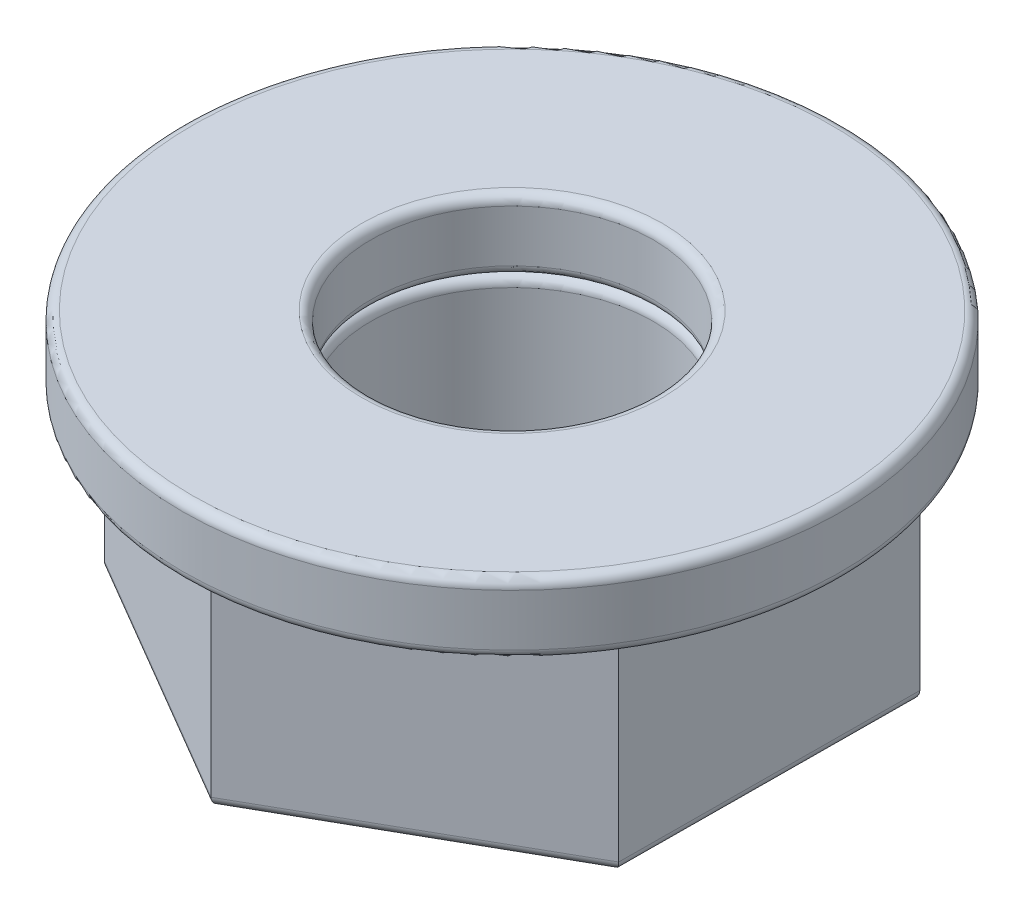
ISO-10303-21;
HEADER;
FILE_DESCRIPTION(('STEP AP214'),'2;1');
FILE_NAME('part.step','',(''),(''),'','','');
FILE_SCHEMA(('AUTOMOTIVE_DESIGN { 1 0 10303 214 1 1 1 1 }'));
ENDSEC;
DATA;
#1=APPLICATION_CONTEXT('core data for automotive mechanical design processes');
#2=APPLICATION_PROTOCOL_DEFINITION('international standard','automotive_design',2000,#1);
#3=PRODUCT_CONTEXT('',#1,'mechanical');
#4=PRODUCT('Part','Part','',(#3));
#5=PRODUCT_RELATED_PRODUCT_CATEGORY('part','',(#4));
#6=PRODUCT_DEFINITION_FORMATION('','',#4);
#7=PRODUCT_DEFINITION_CONTEXT('part definition',#1,'design');
#8=PRODUCT_DEFINITION('design','',#6,#7);
#9=PRODUCT_DEFINITION_SHAPE('','',#8);
#10=(LENGTH_UNIT() NAMED_UNIT(*) SI_UNIT(.MILLI.,.METRE.));
#11=(NAMED_UNIT(*) PLANE_ANGLE_UNIT() SI_UNIT($,.RADIAN.));
#12=(NAMED_UNIT(*) SI_UNIT($,.STERADIAN.) SOLID_ANGLE_UNIT());
#13=UNCERTAINTY_MEASURE_WITH_UNIT(LENGTH_MEASURE(1.E-05),#10,'distance_accuracy_value','');
#14=(GEOMETRIC_REPRESENTATION_CONTEXT(3) GLOBAL_UNCERTAINTY_ASSIGNED_CONTEXT((#13)) GLOBAL_UNIT_ASSIGNED_CONTEXT((#10,
#11,#12)) REPRESENTATION_CONTEXT('',''));
#15=CARTESIAN_POINT('',(0.,0.,0.));
#16=DIRECTION('',(0.,0.,1.));
#17=DIRECTION('',(1.,0.,0.));
#18=AXIS2_PLACEMENT_3D('',#15,#16,#17);
#19=CARTESIAN_POINT('',(0.,0.,0.));
#20=DIRECTION('',(0.,1.,0.));
#21=DIRECTION('',(0.,0.,1.));
#22=AXIS2_PLACEMENT_3D('',#19,#20,#21);
#23=PLANE('',#22);
#24=CARTESIAN_POINT('',(0.,0.,0.));
#25=DIRECTION('',(0.,1.,0.));
#26=DIRECTION('',(0.,0.,1.));
#27=AXIS2_PLACEMENT_3D('',#24,#25,#26);
#28=CIRCLE('',#27,1.6);
#29=CARTESIAN_POINT('',(0.,0.,1.6));
#30=VERTEX_POINT('',#29);
#31=EDGE_CURVE('E318',#30,#30,#28,.T.);
#32=ORIENTED_EDGE('',*,*,#31,.T.);
#33=EDGE_LOOP('',(#32));
#34=FACE_BOUND('',#33,.T.);
#35=DIRECTION('',(-0.862562362658581,0.,-0.505950758992263));
#36=VECTOR('',#35,1.);
#37=CARTESIAN_POINT('',(1.3407695113295,0.,-2.28579026104524));
#38=LINE('',#37,#36);
#39=CARTESIAN_POINT('',(0.0210678888040021,0.,-3.05988389933257));
#40=VERTEX_POINT('',#39);
#41=CARTESIAN_POINT('',(2.66047113385499,0.,-1.51169662275791));
#42=VERTEX_POINT('',#41);
#43=EDGE_CURVE('E379',#40,#42,#38,.F.);
#44=ORIENTED_EDGE('',*,*,#43,.T.);
#45=DIRECTION('',(0.00688502902202738,0.,-0.999976297906788));
#46=VECTOR('',#45,1.);
#47=CARTESIAN_POINT('',(2.64993718945299,0.,0.0182453269083725));
#48=LINE('',#47,#46);
#49=CARTESIAN_POINT('',(2.63940324505099,0.,1.54818727657465));
#50=VERTEX_POINT('',#49);
#51=EDGE_CURVE('E323',#42,#50,#48,.F.);
#52=ORIENTED_EDGE('',*,*,#51,.T.);
#53=DIRECTION('',(0.869447391680608,0.,-0.494025538914526));
#54=VECTOR('',#53,1.);
#55=CARTESIAN_POINT('',(1.30916767812349,0.,2.30403558795361));
#56=LINE('',#55,#54);
#57=CARTESIAN_POINT('',(-0.0210678888040024,0.,3.05988389933257));
#58=VERTEX_POINT('',#57);
#59=EDGE_CURVE('E366',#50,#58,#56,.F.);
#60=ORIENTED_EDGE('',*,*,#59,.T.);
#61=DIRECTION('',(0.862562362658581,0.,0.505950758992263));
#62=VECTOR('',#61,1.);
#63=CARTESIAN_POINT('',(-1.3407695113295,0.,2.28579026104524));
#64=LINE('',#63,#62);
#65=CARTESIAN_POINT('',(-2.66047113385499,0.,1.51169662275791));
#66=VERTEX_POINT('',#65);
#67=EDGE_CURVE('E373',#58,#66,#64,.F.);
#68=ORIENTED_EDGE('',*,*,#67,.T.);
#69=DIRECTION('',(-0.00688502902202696,0.,0.999976297906788));
#70=VECTOR('',#69,1.);
#71=CARTESIAN_POINT('',(-2.64993718945299,0.,-0.0182453269083715));
#72=LINE('',#71,#70);
#73=CARTESIAN_POINT('',(-2.63940324505099,0.,-1.54818727657465));
#74=VERTEX_POINT('',#73);
#75=EDGE_CURVE('E375',#66,#74,#72,.F.);
#76=ORIENTED_EDGE('',*,*,#75,.T.);
#77=DIRECTION('',(-0.869447391680608,0.,0.494025538914526));
#78=VECTOR('',#77,1.);
#79=CARTESIAN_POINT('',(-1.30916767812349,0.,-2.30403558795361));
#80=LINE('',#79,#78);
#81=EDGE_CURVE('E377',#74,#40,#80,.F.);
#82=ORIENTED_EDGE('',*,*,#81,.T.);
#83=EDGE_LOOP('',(#44,#52,#60,#68,#76,#82));
#84=FACE_BOUND('',#83,.T.);
#85=ADVANCED_FACE('F33',(#34,#84),#23,.F.);
#86=CARTESIAN_POINT('',(-0.0218629034758517,2.25,3.17535121628851));
#87=DIRECTION('',(-0.494025538914526,0.,-0.869447391680608));
#88=DIRECTION('',(-0.869447391680608,0.,0.494025538914526));
#89=AXIS2_PLACEMENT_3D('',#86,#87,#88);
#90=PLANE('',#89);
#91=DIRECTION('',(0.,-1.,0.));
#92=VECTOR('',#91,1.);
#93=CARTESIAN_POINT('',(-0.0218629034758517,2.25,3.17535121628851));
#94=LINE('',#93,#92);
#95=CARTESIAN_POINT('',(-0.0218629034758517,2.15,3.17535121628851));
#96=VERTEX_POINT('',#95);
#97=CARTESIAN_POINT('',(-0.0218629034758517,0.0999999999999998,3.17535121628851));
#98=VERTEX_POINT('',#97);
#99=EDGE_CURVE('E174',#96,#98,#94,.T.);
#100=ORIENTED_EDGE('',*,*,#99,.T.);
#101=DIRECTION('',(0.869447391680608,0.,-0.494025538914526));
#102=VECTOR('',#101,1.);
#103=CARTESIAN_POINT('',(-0.0218629034758517,0.0999999999999998,3.17535121628851));
#104=LINE('',#103,#102);
#105=CARTESIAN_POINT('',(2.73900336750574,0.0999999999999998,1.60660943795483));
#106=VERTEX_POINT('',#105);
#107=EDGE_CURVE('E136',#98,#106,#104,.T.);
#108=ORIENTED_EDGE('',*,*,#107,.T.);
#109=DIRECTION('',(0.,-1.,0.));
#110=VECTOR('',#109,1.);
#111=CARTESIAN_POINT('',(2.73900336750574,2.25,1.60660943795483));
#112=LINE('',#111,#110);
#113=CARTESIAN_POINT('',(2.73900336750574,2.15,1.60660943795483));
#114=VERTEX_POINT('',#113);
#115=EDGE_CURVE('E364',#114,#106,#112,.T.);
#116=ORIENTED_EDGE('',*,*,#115,.F.);
#117=DIRECTION('',(0.869447391680608,0.,-0.494025538914526));
#118=VECTOR('',#117,1.);
#119=CARTESIAN_POINT('',(-0.0218629034758517,2.15,3.17535121628851));
#120=LINE('',#119,#118);
#121=EDGE_CURVE('E346',#114,#96,#120,.F.);
#122=ORIENTED_EDGE('',*,*,#121,.T.);
#123=EDGE_LOOP('',(#100,#108,#116,#122));
#124=FACE_BOUND('',#123,.T.);
#125=ADVANCED_FACE('F217',(#124),#90,.F.);
#126=CARTESIAN_POINT('',(2.73900336750574,2.25,1.60660943795483));
#127=DIRECTION('',(-0.999976297906788,0.,-0.00688502902202737));
#128=DIRECTION('',(-0.00688502902202738,0.,0.999976297906788));
#129=AXIS2_PLACEMENT_3D('',#126,#127,#128);
#130=PLANE('',#129);
#131=ORIENTED_EDGE('',*,*,#115,.T.);
#132=DIRECTION('',(0.00688502902202738,0.,-0.999976297906788));
#133=VECTOR('',#132,1.);
#134=CARTESIAN_POINT('',(2.73900336750574,0.0999999999999998,1.60660943795483));
#135=LINE('',#134,#133);
#136=CARTESIAN_POINT('',(2.76086627098159,0.0999999999999998,-1.56874177833368));
#137=VERTEX_POINT('',#136);
#138=EDGE_CURVE('E328',#106,#137,#135,.T.);
#139=ORIENTED_EDGE('',*,*,#138,.T.);
#140=DIRECTION('',(0.,-1.,0.));
#141=VECTOR('',#140,1.);
#142=CARTESIAN_POINT('',(2.76086627098159,2.25,-1.56874177833368));
#143=LINE('',#142,#141);
#144=CARTESIAN_POINT('',(2.76086627098159,2.15,-1.56874177833368));
#145=VERTEX_POINT('',#144);
#146=EDGE_CURVE('E358',#145,#137,#143,.T.);
#147=ORIENTED_EDGE('',*,*,#146,.F.);
#148=DIRECTION('',(0.00688502902202738,0.,-0.999976297906788));
#149=VECTOR('',#148,1.);
#150=CARTESIAN_POINT('',(2.73900336750574,2.15,1.60660943795483));
#151=LINE('',#150,#149);
#152=EDGE_CURVE('E321',#145,#114,#151,.F.);
#153=ORIENTED_EDGE('',*,*,#152,.T.);
#154=EDGE_LOOP('',(#131,#139,#147,#153));
#155=FACE_BOUND('',#154,.T.);
#156=ADVANCED_FACE('F223',(#155),#130,.F.);
#157=CARTESIAN_POINT('',(2.76086627098159,2.25,-1.56874177833368));
#158=DIRECTION('',(-0.505950758992263,0.,0.862562362658581));
#159=DIRECTION('',(0.862562362658581,0.,0.505950758992263));
#160=AXIS2_PLACEMENT_3D('',#157,#158,#159);
#161=PLANE('',#160);
#162=ORIENTED_EDGE('',*,*,#146,.T.);
#163=DIRECTION('',(-0.862562362658581,0.,-0.505950758992263));
#164=VECTOR('',#163,1.);
#165=CARTESIAN_POINT('',(2.76086627098159,0.0999999999999998,-1.56874177833368));
#166=LINE('',#165,#164);
#167=CARTESIAN_POINT('',(0.0218629034758513,0.0999999999999998,-3.17535121628851));
#168=VERTEX_POINT('',#167);
#169=EDGE_CURVE('E333',#137,#168,#166,.T.);
#170=ORIENTED_EDGE('',*,*,#169,.T.);
#171=DIRECTION('',(0.,-1.,0.));
#172=VECTOR('',#171,1.);
#173=CARTESIAN_POINT('',(0.0218629034758513,2.25,-3.17535121628851));
#174=LINE('',#173,#172);
#175=CARTESIAN_POINT('',(0.0218629034758513,2.15,-3.17535121628851));
#176=VERTEX_POINT('',#175);
#177=EDGE_CURVE('E360',#176,#168,#174,.T.);
#178=ORIENTED_EDGE('',*,*,#177,.F.);
#179=DIRECTION('',(-0.862562362658581,0.,-0.505950758992263));
#180=VECTOR('',#179,1.);
#181=CARTESIAN_POINT('',(2.76086627098159,2.15,-1.56874177833368));
#182=LINE('',#181,#180);
#183=EDGE_CURVE('E331',#176,#145,#182,.F.);
#184=ORIENTED_EDGE('',*,*,#183,.T.);
#185=EDGE_LOOP('',(#162,#170,#178,#184));
#186=FACE_BOUND('',#185,.T.);
#187=ADVANCED_FACE('F243',(#186),#161,.F.);
#188=CARTESIAN_POINT('',(0.0218629034758513,2.25,-3.17535121628851));
#189=DIRECTION('',(0.494025538914526,0.,0.869447391680608));
#190=DIRECTION('',(0.869447391680608,0.,-0.494025538914526));
#191=AXIS2_PLACEMENT_3D('',#188,#189,#190);
#192=PLANE('',#191);
#193=ORIENTED_EDGE('',*,*,#177,.T.);
#194=DIRECTION('',(-0.869447391680608,0.,0.494025538914526));
#195=VECTOR('',#194,1.);
#196=CARTESIAN_POINT('',(0.0218629034758513,0.0999999999999998,-3.17535121628851));
#197=LINE('',#196,#195);
#198=CARTESIAN_POINT('',(-2.73900336750574,0.0999999999999998,-1.60660943795483));
#199=VERTEX_POINT('',#198);
#200=EDGE_CURVE('E337',#168,#199,#197,.T.);
#201=ORIENTED_EDGE('',*,*,#200,.T.);
#202=DIRECTION('',(0.,-1.,0.));
#203=VECTOR('',#202,1.);
#204=CARTESIAN_POINT('',(-2.73900336750574,2.25,-1.60660943795483));
#205=LINE('',#204,#203);
#206=CARTESIAN_POINT('',(-2.73900336750574,2.15,-1.60660943795483));
#207=VERTEX_POINT('',#206);
#208=EDGE_CURVE('E368',#207,#199,#205,.T.);
#209=ORIENTED_EDGE('',*,*,#208,.F.);
#210=DIRECTION('',(-0.869447391680608,0.,0.494025538914526));
#211=VECTOR('',#210,1.);
#212=CARTESIAN_POINT('',(0.0218629034758519,2.15,-3.17535121628851));
#213=LINE('',#212,#211);
#214=EDGE_CURVE('E335',#207,#176,#213,.F.);
#215=ORIENTED_EDGE('',*,*,#214,.T.);
#216=EDGE_LOOP('',(#193,#201,#209,#215));
#217=FACE_BOUND('',#216,.T.);
#218=ADVANCED_FACE('F239',(#217),#192,.F.);
#219=CARTESIAN_POINT('',(-2.73900336750574,2.25,-1.60660943795483));
#220=DIRECTION('',(0.999976297906788,0.,0.00688502902202696));
#221=DIRECTION('',(0.00688502902202696,0.,-0.999976297906788));
#222=AXIS2_PLACEMENT_3D('',#219,#220,#221);
#223=PLANE('',#222);
#224=ORIENTED_EDGE('',*,*,#208,.T.);
#225=DIRECTION('',(-0.00688502902202696,0.,0.999976297906788));
#226=VECTOR('',#225,1.);
#227=CARTESIAN_POINT('',(-2.73900336750574,0.0999999999999998,-1.60660943795483));
#228=LINE('',#227,#226);
#229=CARTESIAN_POINT('',(-2.76086627098159,0.0999999999999998,1.56874177833368));
#230=VERTEX_POINT('',#229);
#231=EDGE_CURVE('E341',#199,#230,#228,.T.);
#232=ORIENTED_EDGE('',*,*,#231,.T.);
#233=DIRECTION('',(0.,-1.,0.));
#234=VECTOR('',#233,1.);
#235=CARTESIAN_POINT('',(-2.76086627098159,2.25,1.56874177833368));
#236=LINE('',#235,#234);
#237=CARTESIAN_POINT('',(-2.76086627098159,2.15,1.56874177833368));
#238=VERTEX_POINT('',#237);
#239=EDGE_CURVE('E400',#238,#230,#236,.T.);
#240=ORIENTED_EDGE('',*,*,#239,.F.);
#241=DIRECTION('',(-0.00688502902202696,0.,0.999976297906788));
#242=VECTOR('',#241,1.);
#243=CARTESIAN_POINT('',(-2.73900336750574,2.15,-1.60660943795483));
#244=LINE('',#243,#242);
#245=EDGE_CURVE('E339',#238,#207,#244,.F.);
#246=ORIENTED_EDGE('',*,*,#245,.T.);
#247=EDGE_LOOP('',(#224,#232,#240,#246));
#248=FACE_BOUND('',#247,.T.);
#249=ADVANCED_FACE('F235',(#248),#223,.F.);
#250=CARTESIAN_POINT('',(-2.76086627098159,2.25,1.56874177833368));
#251=DIRECTION('',(0.505950758992263,0.,-0.862562362658581));
#252=DIRECTION('',(-0.862562362658581,0.,-0.505950758992263));
#253=AXIS2_PLACEMENT_3D('',#250,#251,#252);
#254=PLANE('',#253);
#255=ORIENTED_EDGE('',*,*,#239,.T.);
#256=DIRECTION('',(0.862562362658581,0.,0.505950758992263));
#257=VECTOR('',#256,1.);
#258=CARTESIAN_POINT('',(-2.76086627098159,0.0999999999999998,1.56874177833368));
#259=LINE('',#258,#257);
#260=EDGE_CURVE('E344',#230,#98,#259,.T.);
#261=ORIENTED_EDGE('',*,*,#260,.T.);
#262=ORIENTED_EDGE('',*,*,#99,.F.);
#263=DIRECTION('',(0.862562362658581,0.,0.505950758992263));
#264=VECTOR('',#263,1.);
#265=CARTESIAN_POINT('',(-2.76086627098159,2.15,1.56874177833368));
#266=LINE('',#265,#264);
#267=EDGE_CURVE('E144',#96,#238,#266,.F.);
#268=ORIENTED_EDGE('',*,*,#267,.T.);
#269=EDGE_LOOP('',(#255,#261,#262,#268));
#270=FACE_BOUND('',#269,.T.);
#271=ADVANCED_FACE('F232',(#270),#254,.F.);
#272=CARTESIAN_POINT('',(0.,2.25,0.));
#273=DIRECTION('',(0.,-1.,0.));
#274=DIRECTION('',(0.,0.,-1.));
#275=AXIS2_PLACEMENT_3D('',#272,#273,#274);
#276=CYLINDRICAL_SURFACE('',#275,1.5);
#277=CARTESIAN_POINT('',(0.,0.0999999999999998,0.));
#278=DIRECTION('',(0.,1.,0.));
#279=DIRECTION('',(0.,0.,1.));
#280=AXIS2_PLACEMENT_3D('',#277,#278,#279);
#281=CIRCLE('',#280,1.5);
#282=CARTESIAN_POINT('',(0.,0.0999999999999998,1.5));
#283=VERTEX_POINT('',#282);
#284=EDGE_CURVE('E317',#283,#283,#281,.F.);
#285=ORIENTED_EDGE('',*,*,#284,.T.);
#286=EDGE_LOOP('',(#285));
#287=FACE_BOUND('',#286,.T.);
#288=CARTESIAN_POINT('',(0.,2.15,0.));
#289=DIRECTION('',(0.,1.,0.));
#290=DIRECTION('',(0.,0.,1.));
#291=AXIS2_PLACEMENT_3D('',#288,#289,#290);
#292=CIRCLE('',#291,1.5);
#293=CARTESIAN_POINT('',(0.,2.15,1.5));
#294=VERTEX_POINT('',#293);
#295=EDGE_CURVE('E315',#294,#294,#292,.T.);
#296=ORIENTED_EDGE('',*,*,#295,.T.);
#297=EDGE_LOOP('',(#296));
#298=FACE_BOUND('',#297,.T.);
#299=ADVANCED_FACE('F230',(#287,#298),#276,.F.);
#300=CARTESIAN_POINT('',(0.,0.0999999999999998,0.));
#301=DIRECTION('',(0.,1.,0.));
#302=DIRECTION('',(0.,0.,1.));
#303=AXIS2_PLACEMENT_3D('',#300,#301,#302);
#304=TOROIDAL_SURFACE('',#303,1.6,0.1);
#305=ORIENTED_EDGE('',*,*,#284,.F.);
#306=EDGE_LOOP('',(#305));
#307=FACE_BOUND('',#306,.T.);
#308=ORIENTED_EDGE('',*,*,#31,.F.);
#309=EDGE_LOOP('',(#308));
#310=FACE_BOUND('',#309,.T.);
#311=ADVANCED_FACE('F251',(#307,#310),#304,.T.);
#312=CARTESIAN_POINT('',(-2.63900573771506,0.0999999999999998,-1.60592093505263));
#313=DIRECTION('',(-0.00688502902202696,0.,0.999976297906788));
#314=DIRECTION('',(0.999976297906788,0.,0.00688502902202696));
#315=AXIS2_PLACEMENT_3D('',#312,#313,#314);
#316=CYLINDRICAL_SURFACE('',#315,0.1);
#317=CARTESIAN_POINT('',(-2.63940324505099,0.0999999999999998,-1.54818727657465));
#318=DIRECTION('',(-0.505950758992263,0.,0.862562362658581));
#319=DIRECTION('',(0.862562362658581,0.,0.505950758992263));
#320=AXIS2_PLACEMENT_3D('',#317,#318,#319);
#321=ELLIPSE('',#320,0.115470053837925,0.1);
#322=EDGE_CURVE('E169',#74,#199,#321,.F.);
#323=ORIENTED_EDGE('',*,*,#322,.F.);
#324=ORIENTED_EDGE('',*,*,#75,.F.);
#325=CARTESIAN_POINT('',(-2.66047113385499,0.0999999999999998,1.51169662275791));
#326=DIRECTION('',(0.494025538914526,0.,0.869447391680608));
#327=DIRECTION('',(0.869447391680608,0.,-0.494025538914526));
#328=AXIS2_PLACEMENT_3D('',#325,#326,#327);
#329=ELLIPSE('',#328,0.115470053837925,0.1);
#330=EDGE_CURVE('E172',#230,#66,#329,.T.);
#331=ORIENTED_EDGE('',*,*,#330,.F.);
#332=ORIENTED_EDGE('',*,*,#231,.F.);
#333=EDGE_LOOP('',(#323,#324,#331,#332));
#334=FACE_BOUND('',#333,.T.);
#335=ADVANCED_FACE('F254',(#334),#316,.T.);
#336=CARTESIAN_POINT('',(-2.71027119508237,0.0999999999999998,1.48248554206782));
#337=DIRECTION('',(0.862562362658581,0.,0.505950758992263));
#338=DIRECTION('',(0.505950758992263,0.,-0.862562362658581));
#339=AXIS2_PLACEMENT_3D('',#336,#337,#338);
#340=CYLINDRICAL_SURFACE('',#339,0.1);
#341=ORIENTED_EDGE('',*,*,#330,.T.);
#342=ORIENTED_EDGE('',*,*,#67,.F.);
#343=CARTESIAN_POINT('',(-0.0210678888040031,0.0999999999999998,3.05988389933257));
#344=DIRECTION('',(0.999976297906788,0.,0.00688502902202708));
#345=DIRECTION('',(0.00688502902202714,0.,-0.999976297906788));
#346=AXIS2_PLACEMENT_3D('',#343,#344,#345);
#347=ELLIPSE('',#346,0.115470053837925,0.1);
#348=EDGE_CURVE('E166',#98,#58,#347,.T.);
#349=ORIENTED_EDGE('',*,*,#348,.F.);
#350=ORIENTED_EDGE('',*,*,#260,.F.);
#351=EDGE_LOOP('',(#341,#342,#349,#350));
#352=FACE_BOUND('',#351,.T.);
#353=ADVANCED_FACE('F272',(#352),#340,.T.);
#354=CARTESIAN_POINT('',(0.0712654573673039,0.0999999999999998,-3.08840647712045));
#355=DIRECTION('',(-0.869447391680608,0.,0.494025538914526));
#356=DIRECTION('',(0.494025538914526,0.,0.869447391680608));
#357=AXIS2_PLACEMENT_3D('',#354,#355,#356);
#358=CYLINDRICAL_SURFACE('',#357,0.1);
#359=ORIENTED_EDGE('',*,*,#322,.T.);
#360=ORIENTED_EDGE('',*,*,#200,.F.);
#361=CARTESIAN_POINT('',(0.0210678888040017,0.0999999999999998,-3.05988389933257));
#362=DIRECTION('',(-0.999976297906788,0.,-0.00688502902202702));
#363=DIRECTION('',(-0.00688502902202703,0.,0.999976297906788));
#364=AXIS2_PLACEMENT_3D('',#361,#362,#363);
#365=ELLIPSE('',#364,0.115470053837925,0.1);
#366=EDGE_CURVE('E163',#40,#168,#365,.F.);
#367=ORIENTED_EDGE('',*,*,#366,.F.);
#368=ORIENTED_EDGE('',*,*,#81,.F.);
#369=EDGE_LOOP('',(#359,#360,#367,#368));
#370=FACE_BOUND('',#369,.T.);
#371=ADVANCED_FACE('F268',(#370),#358,.T.);
#372=CARTESIAN_POINT('',(-0.0712654573673043,0.0999999999999998,3.08840647712045));
#373=DIRECTION('',(0.869447391680608,0.,-0.494025538914526));
#374=DIRECTION('',(-0.494025538914526,0.,-0.869447391680608));
#375=AXIS2_PLACEMENT_3D('',#372,#373,#374);
#376=CYLINDRICAL_SURFACE('',#375,0.1);
#377=ORIENTED_EDGE('',*,*,#348,.T.);
#378=ORIENTED_EDGE('',*,*,#59,.F.);
#379=CARTESIAN_POINT('',(2.63940324505099,0.0999999999999998,1.54818727657465));
#380=DIRECTION('',(0.505950758992263,0.,-0.862562362658581));
#381=DIRECTION('',(0.862562362658581,0.,0.505950758992263));
#382=AXIS2_PLACEMENT_3D('',#379,#380,#381);
#383=ELLIPSE('',#382,0.115470053837925,0.1);
#384=EDGE_CURVE('E160',#106,#50,#383,.T.);
#385=ORIENTED_EDGE('',*,*,#384,.F.);
#386=ORIENTED_EDGE('',*,*,#107,.F.);
#387=EDGE_LOOP('',(#377,#378,#385,#386));
#388=FACE_BOUND('',#387,.T.);
#389=ADVANCED_FACE('F264',(#388),#376,.T.);
#390=CARTESIAN_POINT('',(2.71027119508237,0.0999999999999998,-1.48248554206782));
#391=DIRECTION('',(-0.862562362658581,0.,-0.505950758992263));
#392=DIRECTION('',(-0.505950758992263,0.,0.862562362658581));
#393=AXIS2_PLACEMENT_3D('',#390,#391,#392);
#394=CYLINDRICAL_SURFACE('',#393,0.1);
#395=ORIENTED_EDGE('',*,*,#366,.T.);
#396=ORIENTED_EDGE('',*,*,#169,.F.);
#397=CARTESIAN_POINT('',(2.66047113385499,0.0999999999999998,-1.51169662275791));
#398=DIRECTION('',(-0.494025538914526,0.,-0.869447391680608));
#399=DIRECTION('',(-0.869447391680608,0.,0.494025538914525));
#400=AXIS2_PLACEMENT_3D('',#397,#398,#399);
#401=ELLIPSE('',#400,0.115470053837925,0.1);
#402=EDGE_CURVE('E158',#42,#137,#401,.F.);
#403=ORIENTED_EDGE('',*,*,#402,.F.);
#404=ORIENTED_EDGE('',*,*,#43,.F.);
#405=EDGE_LOOP('',(#395,#396,#403,#404));
#406=FACE_BOUND('',#405,.T.);
#407=ADVANCED_FACE('F260',(#406),#394,.T.);
#408=CARTESIAN_POINT('',(2.63900573771506,0.0999999999999998,1.60592093505263));
#409=DIRECTION('',(0.00688502902202738,0.,-0.999976297906788));
#410=DIRECTION('',(-0.999976297906788,0.,-0.00688502902202738));
#411=AXIS2_PLACEMENT_3D('',#408,#409,#410);
#412=CYLINDRICAL_SURFACE('',#411,0.1);
#413=ORIENTED_EDGE('',*,*,#384,.T.);
#414=ORIENTED_EDGE('',*,*,#51,.F.);
#415=ORIENTED_EDGE('',*,*,#402,.T.);
#416=ORIENTED_EDGE('',*,*,#138,.F.);
#417=EDGE_LOOP('',(#413,#414,#415,#416));
#418=FACE_BOUND('',#417,.T.);
#419=ADVANCED_FACE('F256',(#418),#412,.T.);
#420=CARTESIAN_POINT('',(0.,2.15,0.));
#421=DIRECTION('',(0.,1.,0.));
#422=DIRECTION('',(0.,0.,1.));
#423=AXIS2_PLACEMENT_3D('',#420,#421,#422);
#424=TOROIDAL_SURFACE('',#423,1.6,0.1);
#425=CARTESIAN_POINT('',(0.,2.25,0.));
#426=DIRECTION('',(0.,1.,0.));
#427=DIRECTION('',(0.,0.,1.));
#428=AXIS2_PLACEMENT_3D('',#425,#426,#427);
#429=CIRCLE('',#428,1.6);
#430=CARTESIAN_POINT('',(0.,2.25,1.6));
#431=VERTEX_POINT('',#430);
#432=EDGE_CURVE('E149',#431,#431,#429,.F.);
#433=ORIENTED_EDGE('',*,*,#432,.F.);
#434=EDGE_LOOP('',(#433));
#435=FACE_BOUND('',#434,.T.);
#436=ORIENTED_EDGE('',*,*,#295,.F.);
#437=EDGE_LOOP('',(#436));
#438=FACE_BOUND('',#437,.T.);
#439=ADVANCED_FACE('F259',(#435,#438),#424,.T.);
#440=CARTESIAN_POINT('',(1.3407695113295,2.15,-2.28579026104524));
#441=DIRECTION('',(0.862562362658581,0.,0.505950758992263));
#442=DIRECTION('',(0.505950758992263,0.,-0.862562362658581));
#443=AXIS2_PLACEMENT_3D('',#440,#441,#442);
#444=CYLINDRICAL_SURFACE('',#443,0.1);
#445=CARTESIAN_POINT('',(2.66047113385499,2.15,-1.51169662275791));
#446=DIRECTION('',(0.494025538914526,0.,0.869447391680608));
#447=DIRECTION('',(-0.869447391680608,0.,0.494025538914525));
#448=AXIS2_PLACEMENT_3D('',#445,#446,#447);
#449=ELLIPSE('',#448,0.115470053837925,0.1);
#450=CARTESIAN_POINT('',(2.66047113385499,2.25,-1.51169662275791));
#451=VERTEX_POINT('',#450);
#452=EDGE_CURVE('E179',#145,#451,#449,.T.);
#453=ORIENTED_EDGE('',*,*,#452,.F.);
#454=ORIENTED_EDGE('',*,*,#183,.F.);
#455=CARTESIAN_POINT('',(0.0210678888040023,2.15,-3.05988389933257));
#456=DIRECTION('',(0.999976297906788,0.,0.00688502902202702));
#457=DIRECTION('',(-0.00688502902202703,0.,0.999976297906788));
#458=AXIS2_PLACEMENT_3D('',#455,#456,#457);
#459=ELLIPSE('',#458,0.115470053837925,0.1);
#460=CARTESIAN_POINT('',(0.0210678888040016,2.25,-3.05988389933257));
#461=VERTEX_POINT('',#460);
#462=EDGE_CURVE('E161',#461,#176,#459,.F.);
#463=ORIENTED_EDGE('',*,*,#462,.F.);
#464=DIRECTION('',(-0.862562362658581,0.,-0.505950758992263));
#465=VECTOR('',#464,1.);
#466=CARTESIAN_POINT('',(-0.0287321724233753,2.25,-3.08909498002265));
#467=LINE('',#466,#465);
#468=EDGE_CURVE('E350',#451,#461,#467,.T.);
#469=ORIENTED_EDGE('',*,*,#468,.F.);
#470=EDGE_LOOP('',(#453,#454,#463,#469));
#471=FACE_BOUND('',#470,.T.);
#472=ADVANCED_FACE('F282',(#471),#444,.T.);
#473=CARTESIAN_POINT('',(-1.30916767812349,2.15,-2.30403558795361));
#474=DIRECTION('',(0.869447391680608,0.,-0.494025538914526));
#475=DIRECTION('',(-0.494025538914526,0.,-0.869447391680608));
#476=AXIS2_PLACEMENT_3D('',#473,#474,#475);
#477=CYLINDRICAL_SURFACE('',#476,0.1);
#478=ORIENTED_EDGE('',*,*,#462,.T.);
#479=ORIENTED_EDGE('',*,*,#214,.F.);
#480=CARTESIAN_POINT('',(-2.63940324505099,2.15,-1.54818727657466));
#481=DIRECTION('',(0.505950758992263,0.,-0.862562362658581));
#482=DIRECTION('',(0.862562362658581,0.,0.505950758992263));
#483=AXIS2_PLACEMENT_3D('',#480,#481,#482);
#484=ELLIPSE('',#483,0.115470053837925,0.1);
#485=CARTESIAN_POINT('',(-2.63940324505099,2.25,-1.54818727657466));
#486=VERTEX_POINT('',#485);
#487=EDGE_CURVE('E56',#486,#207,#484,.F.);
#488=ORIENTED_EDGE('',*,*,#487,.F.);
#489=DIRECTION('',(-0.869447391680608,0.,0.494025538914526));
#490=VECTOR('',#489,1.);
#491=CARTESIAN_POINT('',(-2.68960081361429,2.25,-1.51966469878677));
#492=LINE('',#491,#490);
#493=EDGE_CURVE('E154',#461,#486,#492,.T.);
#494=ORIENTED_EDGE('',*,*,#493,.F.);
#495=EDGE_LOOP('',(#478,#479,#488,#494));
#496=FACE_BOUND('',#495,.T.);
#497=ADVANCED_FACE('F294',(#496),#477,.T.);
#498=CARTESIAN_POINT('',(2.64993718945299,2.15,0.0182453269083725));
#499=DIRECTION('',(-0.00688502902202738,0.,0.999976297906788));
#500=DIRECTION('',(0.999976297906788,0.,0.00688502902202738));
#501=AXIS2_PLACEMENT_3D('',#498,#499,#500);
#502=CYLINDRICAL_SURFACE('',#501,0.1);
#503=ORIENTED_EDGE('',*,*,#452,.T.);
#504=DIRECTION('',(0.00688502902202738,0.,-0.999976297906788));
#505=VECTOR('',#504,1.);
#506=CARTESIAN_POINT('',(2.66086864119091,2.25,-1.56943028123588));
#507=LINE('',#506,#505);
#508=CARTESIAN_POINT('',(2.63940324505099,2.25,1.54818727657465));
#509=VERTEX_POINT('',#508);
#510=EDGE_CURVE('E135',#509,#451,#507,.T.);
#511=ORIENTED_EDGE('',*,*,#510,.F.);
#512=CARTESIAN_POINT('',(2.63940324505099,2.15,1.54818727657465));
#513=DIRECTION('',(-0.505950758992263,0.,0.862562362658581));
#514=DIRECTION('',(-0.862562362658581,0.,-0.505950758992263));
#515=AXIS2_PLACEMENT_3D('',#512,#513,#514);
#516=ELLIPSE('',#515,0.115470053837925,0.1);
#517=EDGE_CURVE('E131',#114,#509,#516,.T.);
#518=ORIENTED_EDGE('',*,*,#517,.F.);
#519=ORIENTED_EDGE('',*,*,#152,.F.);
#520=EDGE_LOOP('',(#503,#511,#518,#519));
#521=FACE_BOUND('',#520,.T.);
#522=ADVANCED_FACE('F291',(#521),#502,.T.);
#523=CARTESIAN_POINT('',(-2.64993718945299,2.15,-0.0182453269083715));
#524=DIRECTION('',(0.00688502902202696,0.,-0.999976297906788));
#525=DIRECTION('',(-0.999976297906788,0.,-0.00688502902202696));
#526=AXIS2_PLACEMENT_3D('',#523,#524,#525);
#527=CYLINDRICAL_SURFACE('',#526,0.1);
#528=ORIENTED_EDGE('',*,*,#487,.T.);
#529=ORIENTED_EDGE('',*,*,#245,.F.);
#530=CARTESIAN_POINT('',(-2.66047113385499,2.15,1.51169662275791));
#531=DIRECTION('',(-0.494025538914526,0.,-0.869447391680608));
#532=DIRECTION('',(0.869447391680608,0.,-0.494025538914526));
#533=AXIS2_PLACEMENT_3D('',#530,#531,#532);
#534=ELLIPSE('',#533,0.115470053837925,0.1);
#535=CARTESIAN_POINT('',(-2.66047113385499,2.25,1.51169662275791));
#536=VERTEX_POINT('',#535);
#537=EDGE_CURVE('E48',#536,#238,#534,.F.);
#538=ORIENTED_EDGE('',*,*,#537,.F.);
#539=DIRECTION('',(-0.00688502902202696,0.,0.999976297906788));
#540=VECTOR('',#539,1.);
#541=CARTESIAN_POINT('',(-2.66086864119091,2.25,1.56943028123588));
#542=LINE('',#541,#540);
#543=EDGE_CURVE('E148',#486,#536,#542,.T.);
#544=ORIENTED_EDGE('',*,*,#543,.F.);
#545=EDGE_LOOP('',(#528,#529,#538,#544));
#546=FACE_BOUND('',#545,.T.);
#547=ADVANCED_FACE('F288',(#546),#527,.T.);
#548=CARTESIAN_POINT('',(1.30916767812349,2.15,2.30403558795361));
#549=DIRECTION('',(-0.869447391680608,0.,0.494025538914526));
#550=DIRECTION('',(0.494025538914526,0.,0.869447391680608));
#551=AXIS2_PLACEMENT_3D('',#548,#549,#550);
#552=CYLINDRICAL_SURFACE('',#551,0.1);
#553=ORIENTED_EDGE('',*,*,#517,.T.);
#554=DIRECTION('',(0.869447391680608,0.,-0.494025538914526));
#555=VECTOR('',#554,1.);
#556=CARTESIAN_POINT('',(2.68960081361429,2.25,1.51966469878677));
#557=LINE('',#556,#555);
#558=CARTESIAN_POINT('',(-0.021067888804004,2.25,3.05988389933257));
#559=VERTEX_POINT('',#558);
#560=EDGE_CURVE('E125',#559,#509,#557,.T.);
#561=ORIENTED_EDGE('',*,*,#560,.F.);
#562=CARTESIAN_POINT('',(-0.0210678888040038,2.15,3.05988389933257));
#563=DIRECTION('',(-0.999976297906788,0.,-0.00688502902202708));
#564=DIRECTION('',(-0.00688502902202714,0.,0.999976297906788));
#565=AXIS2_PLACEMENT_3D('',#562,#563,#564);
#566=ELLIPSE('',#565,0.115470053837925,0.1);
#567=EDGE_CURVE('E129',#96,#559,#566,.T.);
#568=ORIENTED_EDGE('',*,*,#567,.F.);
#569=ORIENTED_EDGE('',*,*,#121,.F.);
#570=EDGE_LOOP('',(#553,#561,#568,#569));
#571=FACE_BOUND('',#570,.T.);
#572=ADVANCED_FACE('F127',(#571),#552,.T.);
#573=CARTESIAN_POINT('',(-1.3407695113295,2.15,2.28579026104524));
#574=DIRECTION('',(-0.862562362658581,0.,-0.505950758992263));
#575=DIRECTION('',(-0.505950758992263,0.,0.862562362658581));
#576=AXIS2_PLACEMENT_3D('',#573,#574,#575);
#577=CYLINDRICAL_SURFACE('',#576,0.1);
#578=ORIENTED_EDGE('',*,*,#537,.T.);
#579=ORIENTED_EDGE('',*,*,#267,.F.);
#580=ORIENTED_EDGE('',*,*,#567,.T.);
#581=DIRECTION('',(0.862562362658581,0.,0.505950758992263));
#582=VECTOR('',#581,1.);
#583=CARTESIAN_POINT('',(0.0287321724233745,2.25,3.08909498002265));
#584=LINE('',#583,#582);
#585=EDGE_CURVE('E141',#536,#559,#584,.T.);
#586=ORIENTED_EDGE('',*,*,#585,.F.);
#587=EDGE_LOOP('',(#578,#579,#580,#586));
#588=FACE_BOUND('',#587,.T.);
#589=ADVANCED_FACE('F140',(#588),#577,.T.);
#590=CARTESIAN_POINT('',(0.,2.25,0.));
#591=DIRECTION('',(0.,1.,0.));
#592=DIRECTION('',(0.,0.,1.));
#593=AXIS2_PLACEMENT_3D('',#590,#591,#592);
#594=PLANE('',#593);
#595=CARTESIAN_POINT('',(0.,2.25,0.));
#596=DIRECTION('',(0.,1.,0.));
#597=DIRECTION('',(0.,0.,1.));
#598=AXIS2_PLACEMENT_3D('',#595,#596,#597);
#599=CIRCLE('',#598,3.4);
#600=CARTESIAN_POINT('',(0.,2.25,3.4));
#601=VERTEX_POINT('',#600);
#602=EDGE_CURVE('E11',#601,#601,#599,.F.);
#603=ORIENTED_EDGE('',*,*,#602,.T.);
#604=EDGE_LOOP('',(#603));
#605=FACE_BOUND('',#604,.T.);
#606=ORIENTED_EDGE('',*,*,#510,.T.);
#607=ORIENTED_EDGE('',*,*,#468,.T.);
#608=ORIENTED_EDGE('',*,*,#493,.T.);
#609=ORIENTED_EDGE('',*,*,#543,.T.);
#610=ORIENTED_EDGE('',*,*,#585,.T.);
#611=ORIENTED_EDGE('',*,*,#560,.T.);
#612=EDGE_LOOP('',(#606,#607,#608,#609,#610,#611));
#613=FACE_BOUND('',#612,.T.);
#614=ADVANCED_FACE('F146',(#605,#613),#594,.F.);
#615=CARTESIAN_POINT('',(0.,3.,0.));
#616=DIRECTION('',(0.,1.,0.));
#617=DIRECTION('',(0.,0.,1.));
#618=AXIS2_PLACEMENT_3D('',#615,#616,#617);
#619=PLANE('',#618);
#620=CARTESIAN_POINT('',(0.,3.,0.));
#621=DIRECTION('',(0.,1.,0.));
#622=DIRECTION('',(0.,0.,1.));
#623=AXIS2_PLACEMENT_3D('',#620,#621,#622);
#624=CIRCLE('',#623,1.6);
#625=CARTESIAN_POINT('',(0.,3.,1.6));
#626=VERTEX_POINT('',#625);
#627=EDGE_CURVE('E192',#626,#626,#624,.F.);
#628=ORIENTED_EDGE('',*,*,#627,.T.);
#629=EDGE_LOOP('',(#628));
#630=FACE_BOUND('',#629,.T.);
#631=CARTESIAN_POINT('',(0.,3.,0.));
#632=DIRECTION('',(0.,1.,0.));
#633=DIRECTION('',(0.,0.,1.));
#634=AXIS2_PLACEMENT_3D('',#631,#632,#633);
#635=CIRCLE('',#634,3.4);
#636=CARTESIAN_POINT('',(0.,3.,3.4));
#637=VERTEX_POINT('',#636);
#638=EDGE_CURVE('E189',#637,#637,#635,.T.);
#639=ORIENTED_EDGE('',*,*,#638,.T.);
#640=EDGE_LOOP('',(#639));
#641=FACE_BOUND('',#640,.T.);
#642=ADVANCED_FACE('F491',(#630,#641),#619,.T.);
#643=CARTESIAN_POINT('',(0.,3.,0.));
#644=DIRECTION('',(0.,-1.,0.));
#645=DIRECTION('',(0.,0.,-1.));
#646=AXIS2_PLACEMENT_3D('',#643,#644,#645);
#647=CYLINDRICAL_SURFACE('',#646,3.5);
#648=CARTESIAN_POINT('',(0.,2.35,0.));
#649=DIRECTION('',(0.,1.,0.));
#650=DIRECTION('',(0.,0.,1.));
#651=AXIS2_PLACEMENT_3D('',#648,#649,#650);
#652=CIRCLE('',#651,3.5);
#653=CARTESIAN_POINT('',(0.,2.35,3.5));
#654=VERTEX_POINT('',#653);
#655=EDGE_CURVE('E41',#654,#654,#652,.T.);
#656=ORIENTED_EDGE('',*,*,#655,.T.);
#657=EDGE_LOOP('',(#656));
#658=FACE_BOUND('',#657,.T.);
#659=CARTESIAN_POINT('',(0.,2.9,0.));
#660=DIRECTION('',(0.,1.,0.));
#661=DIRECTION('',(0.,0.,1.));
#662=AXIS2_PLACEMENT_3D('',#659,#660,#661);
#663=CIRCLE('',#662,3.5);
#664=CARTESIAN_POINT('',(0.,2.9,3.5));
#665=VERTEX_POINT('',#664);
#666=EDGE_CURVE('E195',#665,#665,#663,.F.);
#667=ORIENTED_EDGE('',*,*,#666,.T.);
#668=EDGE_LOOP('',(#667));
#669=FACE_BOUND('',#668,.T.);
#670=ADVANCED_FACE('F200',(#658,#669),#647,.T.);
#671=CARTESIAN_POINT('',(0.,3.,0.));
#672=DIRECTION('',(0.,-1.,0.));
#673=DIRECTION('',(0.,0.,-1.));
#674=AXIS2_PLACEMENT_3D('',#671,#672,#673);
#675=CYLINDRICAL_SURFACE('',#674,1.5);
#676=CARTESIAN_POINT('',(0.,2.35,0.));
#677=DIRECTION('',(0.,1.,0.));
#678=DIRECTION('',(0.,0.,1.));
#679=AXIS2_PLACEMENT_3D('',#676,#677,#678);
#680=CIRCLE('',#679,1.5);
#681=CARTESIAN_POINT('',(0.,2.35,1.5));
#682=VERTEX_POINT('',#681);
#683=EDGE_CURVE('E186',#682,#682,#680,.F.);
#684=ORIENTED_EDGE('',*,*,#683,.T.);
#685=EDGE_LOOP('',(#684));
#686=FACE_BOUND('',#685,.T.);
#687=CARTESIAN_POINT('',(0.,2.9,0.));
#688=DIRECTION('',(0.,1.,0.));
#689=DIRECTION('',(0.,0.,1.));
#690=AXIS2_PLACEMENT_3D('',#687,#688,#689);
#691=CIRCLE('',#690,1.5);
#692=CARTESIAN_POINT('',(0.,2.9,1.5));
#693=VERTEX_POINT('',#692);
#694=EDGE_CURVE('E152',#693,#693,#691,.T.);
#695=ORIENTED_EDGE('',*,*,#694,.T.);
#696=EDGE_LOOP('',(#695));
#697=FACE_BOUND('',#696,.T.);
#698=ADVANCED_FACE('F302',(#686,#697),#675,.F.);
#699=CARTESIAN_POINT('',(0.,2.35,0.));
#700=DIRECTION('',(0.,1.,0.));
#701=DIRECTION('',(0.,0.,1.));
#702=AXIS2_PLACEMENT_3D('',#699,#700,#701);
#703=TOROIDAL_SURFACE('',#702,1.6,0.1);
#704=ORIENTED_EDGE('',*,*,#683,.F.);
#705=EDGE_LOOP('',(#704));
#706=FACE_BOUND('',#705,.T.);
#707=ORIENTED_EDGE('',*,*,#432,.T.);
#708=EDGE_LOOP('',(#707));
#709=FACE_BOUND('',#708,.T.);
#710=ADVANCED_FACE('F212',(#706,#709),#703,.T.);
#711=CARTESIAN_POINT('',(0.,2.9,0.));
#712=DIRECTION('',(0.,1.,0.));
#713=DIRECTION('',(0.,0.,1.));
#714=AXIS2_PLACEMENT_3D('',#711,#712,#713);
#715=TOROIDAL_SURFACE('',#714,1.6,0.1);
#716=ORIENTED_EDGE('',*,*,#627,.F.);
#717=EDGE_LOOP('',(#716));
#718=FACE_BOUND('',#717,.T.);
#719=ORIENTED_EDGE('',*,*,#694,.F.);
#720=EDGE_LOOP('',(#719));
#721=FACE_BOUND('',#720,.T.);
#722=ADVANCED_FACE('F205',(#718,#721),#715,.T.);
#723=CARTESIAN_POINT('',(0.,2.35,0.));
#724=DIRECTION('',(0.,1.,0.));
#725=DIRECTION('',(0.,0.,1.));
#726=AXIS2_PLACEMENT_3D('',#723,#724,#725);
#727=TOROIDAL_SURFACE('',#726,3.4,0.1);
#728=ORIENTED_EDGE('',*,*,#602,.F.);
#729=EDGE_LOOP('',(#728));
#730=FACE_BOUND('',#729,.T.);
#731=ORIENTED_EDGE('',*,*,#655,.F.);
#732=EDGE_LOOP('',(#731));
#733=FACE_BOUND('',#732,.T.);
#734=ADVANCED_FACE('F203',(#730,#733),#727,.T.);
#735=CARTESIAN_POINT('',(0.,2.9,0.));
#736=DIRECTION('',(0.,1.,0.));
#737=DIRECTION('',(0.,0.,1.));
#738=AXIS2_PLACEMENT_3D('',#735,#736,#737);
#739=TOROIDAL_SURFACE('',#738,3.4,0.1);
#740=ORIENTED_EDGE('',*,*,#666,.F.);
#741=EDGE_LOOP('',(#740));
#742=FACE_BOUND('',#741,.T.);
#743=ORIENTED_EDGE('',*,*,#638,.F.);
#744=EDGE_LOOP('',(#743));
#745=FACE_BOUND('',#744,.T.);
#746=ADVANCED_FACE('F35',(#742,#745),#739,.T.);
#747=CLOSED_SHELL('',(#85,#125,#156,#187,#218,#249,#271,#299,#311,#335,#353,#371,#389,#407,#419,
#439,#472,#497,#522,#547,#572,#589,#614,#642,#670,#698,#710,#722,#734,#746));
#748=MANIFOLD_SOLID_BREP('B2',#747);
#749=ADVANCED_BREP_SHAPE_REPRESENTATION('',(#18,#748),#14);
#750=SHAPE_DEFINITION_REPRESENTATION(#9,#749);
ENDSEC;
END-ISO-10303-21;
